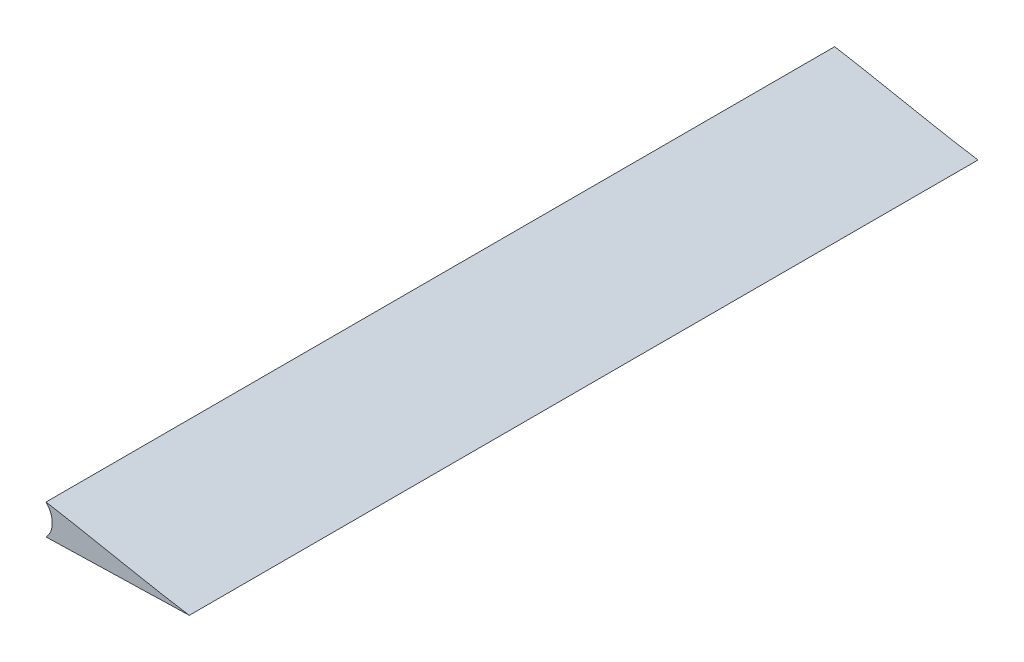
ISO-10303-21;
HEADER;
FILE_DESCRIPTION(('STEP AP214'),'2;1');
FILE_NAME('part.step','',(''),(''),'','','');
FILE_SCHEMA(('AUTOMOTIVE_DESIGN { 1 0 10303 214 1 1 1 1 }'));
ENDSEC;
DATA;
#1=APPLICATION_CONTEXT('core data for automotive mechanical design processes');
#2=APPLICATION_PROTOCOL_DEFINITION('international standard','automotive_design',2000,#1);
#3=PRODUCT_CONTEXT('',#1,'mechanical');
#4=PRODUCT('Part','Part','',(#3));
#5=PRODUCT_RELATED_PRODUCT_CATEGORY('part','',(#4));
#6=PRODUCT_DEFINITION_FORMATION('','',#4);
#7=PRODUCT_DEFINITION_CONTEXT('part definition',#1,'design');
#8=PRODUCT_DEFINITION('design','',#6,#7);
#9=PRODUCT_DEFINITION_SHAPE('','',#8);
#10=(LENGTH_UNIT() NAMED_UNIT(*) SI_UNIT(.MILLI.,.METRE.));
#11=(NAMED_UNIT(*) PLANE_ANGLE_UNIT() SI_UNIT($,.RADIAN.));
#12=(NAMED_UNIT(*) SI_UNIT($,.STERADIAN.) SOLID_ANGLE_UNIT());
#13=UNCERTAINTY_MEASURE_WITH_UNIT(LENGTH_MEASURE(1.E-05),#10,'distance_accuracy_value','');
#14=(GEOMETRIC_REPRESENTATION_CONTEXT(3) GLOBAL_UNCERTAINTY_ASSIGNED_CONTEXT((#13)) GLOBAL_UNIT_ASSIGNED_CONTEXT((#10,
#11,#12)) REPRESENTATION_CONTEXT('',''));
#15=CARTESIAN_POINT('',(0.,0.,0.));
#16=DIRECTION('',(0.,0.,1.));
#17=DIRECTION('',(1.,0.,0.));
#18=AXIS2_PLACEMENT_3D('',#15,#16,#17);
#19=CARTESIAN_POINT('',(100.918242869635,-5.70312155972156,875.));
#20=CARTESIAN_POINT('',(100.917928301793,-5.69198405836472,875.));
#21=CARTESIAN_POINT('',(100.10387255541,-5.62352228888477,875.));
#22=CARTESIAN_POINT('',(99.2805924787461,-5.46457437941949,875.));
#23=CARTESIAN_POINT('',(97.3018387610102,-5.16729318068841,875.));
#24=CARTESIAN_POINT('',(94.8937922035613,-4.74031320806905,875.));
#25=CARTESIAN_POINT('',(91.7634180326536,-4.19402072090437,875.));
#26=CARTESIAN_POINT('',(88.0757791314598,-3.52709242375945,875.));
#27=CARTESIAN_POINT('',(83.8258683203558,-2.7338398887422,875.));
#28=CARTESIAN_POINT('',(79.0746653904455,-1.82915983321444,875.));
#29=CARTESIAN_POINT('',(73.8682926545335,-0.815261424369521,875.));
#30=CARTESIAN_POINT('',(68.2575867578557,0.281496710181075,875.));
#31=CARTESIAN_POINT('',(62.2976992437029,1.44772435993441,875.));
#32=CARTESIAN_POINT('',(56.0406275155923,2.65954132518187,875.));
#33=CARTESIAN_POINT('',(49.5223044176383,3.86329842138598,875.));
#34=CARTESIAN_POINT('',(42.7761633390597,5.02418206260204,875.));
#35=CARTESIAN_POINT('',(35.8424652144832,6.15936269502018,875.));
#36=CARTESIAN_POINT('',(28.7548949857195,7.22523749141442,875.));
#37=CARTESIAN_POINT('',(21.5570881683195,8.21203636309571,875.));
#38=CARTESIAN_POINT('',(14.2899389211875,9.11702244002896,875.));
#39=CARTESIAN_POINT('',(6.98649158126674,9.89650210355032,875.));
#40=CARTESIAN_POINT('',(-0.31229146466516,10.5674397355271,875.));
#41=CARTESIAN_POINT('',(-7.57325093320835,11.1014525657359,875.));
#42=CARTESIAN_POINT('',(-14.7567884271768,11.4844721960287,875.));
#43=CARTESIAN_POINT('',(-21.8292142161482,11.7343249899717,875.));
#44=CARTESIAN_POINT('',(-28.7563545150705,11.8210091917914,875.));
#45=CARTESIAN_POINT('',(-35.5035223333169,11.7506173931394,875.));
#46=CARTESIAN_POINT('',(-42.0399272145928,11.5280996785659,875.));
#47=CARTESIAN_POINT('',(-48.3376180525475,11.1396685856208,875.));
#48=CARTESIAN_POINT('',(-54.368823590549,10.5993161188278,875.));
#49=CARTESIAN_POINT('',(-60.1078137628036,9.91606598300808,875.));
#50=CARTESIAN_POINT('',(-65.5246311998618,9.08284133402565,875.));
#51=CARTESIAN_POINT('',(-70.6007109713803,8.13358039825953,875.));
#52=CARTESIAN_POINT('',(-75.3121243874859,7.06030936022038,875.));
#53=CARTESIAN_POINT('',(-79.6390126776094,5.88240060478776,875.));
#54=CARTESIAN_POINT('',(-83.5657941936788,4.62059294729546,875.));
#55=CARTESIAN_POINT('',(-87.0745733985271,3.28647899388426,875.));
#56=CARTESIAN_POINT('',(-90.1552552216402,1.90843012274513,875.));
#57=CARTESIAN_POINT('',(-92.7947781002031,0.504611279427612,875.));
#58=CARTESIAN_POINT('',(-94.9830779234318,-0.904381490727133,875.));
#59=CARTESIAN_POINT('',(-96.7129189019401,-2.2701975801555,875.));
#60=CARTESIAN_POINT('',(-98.000485424671,-3.58079275915454,875.));
#61=CARTESIAN_POINT('',(-98.7619057356522,-4.7431958355309,875.));
#62=CARTESIAN_POINT('',(-99.2301090632581,-5.85819372427054,875.));
#63=CARTESIAN_POINT('',(-98.6060252918995,-6.87008215824494,875.));
#64=CARTESIAN_POINT('',(-97.444377041171,-7.5453305846849,875.));
#65=CARTESIAN_POINT('',(-95.7467090817251,-8.18861564790779,875.));
#66=CARTESIAN_POINT('',(-93.4448586660228,-8.65302005006277,875.));
#67=CARTESIAN_POINT('',(-90.5328491856375,-8.98180980569674,875.));
#68=CARTESIAN_POINT('',(-87.0127860582048,-9.24993802916623,875.));
#69=CARTESIAN_POINT('',(-82.9066310664121,-9.47123086211927,875.));
#70=CARTESIAN_POINT('',(-78.2402207744729,-9.5911083476405,875.));
#71=CARTESIAN_POINT('',(-73.047587860927,-9.70003593625301,875.));
#72=CARTESIAN_POINT('',(-67.364458993906,-9.72682521205635,875.));
#73=CARTESIAN_POINT('',(-61.2329456663301,-9.73559881849179,875.));
#74=CARTESIAN_POINT('',(-54.695580066044,-9.66397132949298,875.));
#75=CARTESIAN_POINT('',(-47.7878601670729,-9.57405054041112,875.));
#76=CARTESIAN_POINT('',(-40.5476604494291,-9.39990522549842,875.));
#77=CARTESIAN_POINT('',(-33.0149068418517,-9.22416889674421,875.));
#78=CARTESIAN_POINT('',(-25.241541211049,-9.02440552376383,875.));
#79=CARTESIAN_POINT('',(-17.2817921202236,-8.80197066728498,875.));
#80=CARTESIAN_POINT('',(-9.19412489466216,-8.57548457521884,875.));
#81=CARTESIAN_POINT('',(-1.03475350320872,-8.38960097567362,875.));
#82=CARTESIAN_POINT('',(7.13493172426889,-8.16391426134132,875.));
#83=CARTESIAN_POINT('',(15.2619153059295,-7.93721196551508,875.));
#84=CARTESIAN_POINT('',(23.2920199469726,-7.75326587738116,875.));
#85=CARTESIAN_POINT('',(31.1719891282351,-7.52041286471104,875.));
#86=CARTESIAN_POINT('',(38.8533388610302,-7.32032333842978,875.));
#87=CARTESIAN_POINT('',(46.282726983524,-7.15503997672915,875.));
#88=CARTESIAN_POINT('',(53.396722649005,-6.94282534524174,875.));
#89=CARTESIAN_POINT('',(60.1347643764967,-6.76442572644932,875.));
#90=CARTESIAN_POINT('',(66.4617978730972,-6.61076011362349,875.));
#91=CARTESIAN_POINT('',(72.370019545206,-6.44406791450927,875.));
#92=CARTESIAN_POINT('',(77.8516908370389,-6.30469387873606,875.));
#93=CARTESIAN_POINT('',(82.8702925290339,-6.18945193371191,875.));
#94=CARTESIAN_POINT('',(87.3729744895545,-6.07418455055627,875.));
#95=CARTESIAN_POINT('',(91.2866368972505,-5.94365740290611,875.));
#96=CARTESIAN_POINT('',(94.6105801016291,-5.86381881005005,875.));
#97=CARTESIAN_POINT('',(97.1585045394195,-5.8207005319733,875.));
#98=CARTESIAN_POINT('',(99.2314529908179,-5.73825639570641,875.));
#99=CARTESIAN_POINT('',(100.085997803177,-5.73399991417884,875.));
#100=CARTESIAN_POINT('',(100.918560501522,-5.71436754579513,875.));
#101=CARTESIAN_POINT('',(100.918242869635,-5.70312155972156,875.));
#102=B_SPLINE_CURVE_WITH_KNOTS('',3,(#19,#20,#21,#22,#23,#24,#25,#26,#27,#28,#29,#30,#31,#32,
#33,#34,#35,#36,#37,#38,#39,#40,#41,#42,#43,#44,#45,#46,#47,#48,#49,#50,#51,#52,#53,#54,#55,#56,
#57,#58,#59,#60,#61,#62,#63,#64,#65,#66,#67,#68,#69,#70,#71,#72,#73,#74,#75,#76,#77,#78,#79,#80,
#81,#82,#83,#84,#85,#86,#87,#88,#89,#90,#91,#92,#93,#94,#95,#96,#97,#98,#99,#100,#101),
.UNSPECIFIED.,.T.,.F.,(4,1,1,1,1,1,1,1,1,1,1,1,1,1,1,1,1,1,1,1,1,1,1,1,1,1,1,1,1,1,1,1,1,1,1,1,
1,1,1,1,1,1,1,1,1,1,1,1,1,1,1,1,1,1,1,1,1,1,1,1,1,1,1,1,1,1,1,1,1,1,1,1,1,1,1,1,1,1,1,1,4),(0.,
0.000950607256080683,0.00375650719066246,0.00831711830518814,0.0145215342884101,
0.0222932577146515,0.0315598243393391,0.0422207516758567,0.0541509547964426,0.0672310262306302,
0.0813310375166049,0.0963074228768398,0.112011952110719,0.128327294433554,0.145184499499575,
0.162487628976913,0.180135525061467,0.198033487871075,0.21605882858555,0.234134494923981,
0.252191782121554,0.270104077304323,0.287817033152811,0.305234681094631,0.32228444776858,
0.338896328665586,0.3549861088409,0.3705058476665,0.385416955636935,0.399632136124818,
0.413115968198781,0.425822529578469,0.437703697321329,0.448737409392791,0.458879724153294,
0.468105332962517,0.476404611912194,0.483748471478625,0.490133859938562,0.495557185945741,
0.500011534122997,0.503516098018531,0.506001285786605,0.508215361182165,0.511493606790907,
0.515843652138343,0.521547382532886,0.528754591564628,0.537448665030227,0.547575187866189,
0.559073789891025,0.571867409394551,0.585873248090889,0.600979910722737,0.617080267312518,
0.634081341136593,0.651920682144897,0.670483603160468,0.689642386701722,0.709259498553066,
0.729200940708723,0.749303287247489,0.769441295125621,0.789466277541535,0.809254099942275,
0.828669735918119,0.847597547600215,0.865914742719292,0.883466593841964,0.900078508925935,
0.915617835106359,0.930134997771401,0.943663107271565,0.956049855203852,0.967158864622839,
0.97685265729829,0.984995817128692,0.991471780599749,0.99618355316532,0.999040133363778,1.),.UNSPECIFIED.);
#103=DIRECTION('',(0.,0.,-1.));
#104=VECTOR('',#103,1.);
#105=SURFACE_OF_LINEAR_EXTRUSION('',#102,#104);
#106=DIRECTION('',(0.,0.,-1.));
#107=VECTOR('',#106,1.);
#108=CARTESIAN_POINT('',(44.3701269819734,-7.19395111063311,875.));
#109=LINE('',#108,#107);
#110=CARTESIAN_POINT('',(44.3701269819732,-7.19395111063311,-524.707472239184));
#111=VERTEX_POINT('',#110);
#112=CARTESIAN_POINT('',(44.3701269819732,-7.19395111063311,-835.9));
#113=VERTEX_POINT('',#112);
#114=EDGE_CURVE('E53',#111,#113,#109,.T.);
#115=ORIENTED_EDGE('',*,*,#114,.T.);
#116=CARTESIAN_POINT('',(100.918242869635,-5.70312155972156,-835.9));
#117=CARTESIAN_POINT('',(100.917928301793,-5.69198405836472,-835.9));
#118=CARTESIAN_POINT('',(100.10387255541,-5.62352228888477,-835.9));
#119=CARTESIAN_POINT('',(99.2805924787461,-5.46457437941949,-835.9));
#120=CARTESIAN_POINT('',(97.3018387610102,-5.16729318068841,-835.9));
#121=CARTESIAN_POINT('',(94.8937922035613,-4.74031320806905,-835.9));
#122=CARTESIAN_POINT('',(91.7634180326536,-4.19402072090437,-835.9));
#123=CARTESIAN_POINT('',(88.0757791314598,-3.52709242375945,-835.9));
#124=CARTESIAN_POINT('',(83.8258683203558,-2.7338398887422,-835.9));
#125=CARTESIAN_POINT('',(79.0746653904455,-1.82915983321444,-835.9));
#126=CARTESIAN_POINT('',(73.8682926545335,-0.815261424369521,-835.9));
#127=CARTESIAN_POINT('',(68.2575867578557,0.281496710181075,-835.9));
#128=CARTESIAN_POINT('',(62.2976992437029,1.44772435993441,-835.9));
#129=CARTESIAN_POINT('',(56.0406275155923,2.65954132518187,-835.9));
#130=CARTESIAN_POINT('',(49.5223044176383,3.86329842138598,-835.9));
#131=CARTESIAN_POINT('',(42.7761633390597,5.02418206260204,-835.9));
#132=CARTESIAN_POINT('',(35.8424652144832,6.15936269502018,-835.9));
#133=CARTESIAN_POINT('',(28.7548949857195,7.22523749141442,-835.9));
#134=CARTESIAN_POINT('',(21.5570881683195,8.21203636309571,-835.9));
#135=CARTESIAN_POINT('',(14.2899389211875,9.11702244002896,-835.9));
#136=CARTESIAN_POINT('',(6.98649158126674,9.89650210355032,-835.9));
#137=CARTESIAN_POINT('',(-0.31229146466516,10.5674397355271,-835.9));
#138=CARTESIAN_POINT('',(-7.57325093320835,11.1014525657359,-835.9));
#139=CARTESIAN_POINT('',(-14.7567884271768,11.4844721960287,-835.9));
#140=CARTESIAN_POINT('',(-21.8292142161482,11.7343249899717,-835.9));
#141=CARTESIAN_POINT('',(-28.7563545150705,11.8210091917914,-835.9));
#142=CARTESIAN_POINT('',(-35.5035223333169,11.7506173931394,-835.9));
#143=CARTESIAN_POINT('',(-42.0399272145928,11.5280996785659,-835.9));
#144=CARTESIAN_POINT('',(-48.3376180525475,11.1396685856208,-835.9));
#145=CARTESIAN_POINT('',(-54.368823590549,10.5993161188278,-835.9));
#146=CARTESIAN_POINT('',(-60.1078137628036,9.91606598300808,-835.9));
#147=CARTESIAN_POINT('',(-65.5246311998618,9.08284133402565,-835.9));
#148=CARTESIAN_POINT('',(-70.6007109713803,8.13358039825953,-835.9));
#149=CARTESIAN_POINT('',(-75.3121243874859,7.06030936022038,-835.9));
#150=CARTESIAN_POINT('',(-79.6390126776094,5.88240060478776,-835.9));
#151=CARTESIAN_POINT('',(-83.5657941936788,4.62059294729546,-835.9));
#152=CARTESIAN_POINT('',(-87.0745733985271,3.28647899388426,-835.9));
#153=CARTESIAN_POINT('',(-90.1552552216402,1.90843012274513,-835.9));
#154=CARTESIAN_POINT('',(-92.7947781002031,0.504611279427612,-835.9));
#155=CARTESIAN_POINT('',(-94.9830779234318,-0.904381490727133,-835.9));
#156=CARTESIAN_POINT('',(-96.7129189019401,-2.2701975801555,-835.9));
#157=CARTESIAN_POINT('',(-98.000485424671,-3.58079275915454,-835.9));
#158=CARTESIAN_POINT('',(-98.7619057356522,-4.7431958355309,-835.9));
#159=CARTESIAN_POINT('',(-99.2301090632581,-5.85819372427054,-835.9));
#160=CARTESIAN_POINT('',(-98.6060252918995,-6.87008215824494,-835.9));
#161=CARTESIAN_POINT('',(-97.444377041171,-7.5453305846849,-835.9));
#162=CARTESIAN_POINT('',(-95.7467090817251,-8.18861564790779,-835.9));
#163=CARTESIAN_POINT('',(-93.4448586660228,-8.65302005006277,-835.9));
#164=CARTESIAN_POINT('',(-90.5328491856375,-8.98180980569674,-835.9));
#165=CARTESIAN_POINT('',(-87.0127860582048,-9.24993802916623,-835.9));
#166=CARTESIAN_POINT('',(-82.9066310664121,-9.47123086211927,-835.9));
#167=CARTESIAN_POINT('',(-78.2402207744729,-9.5911083476405,-835.9));
#168=CARTESIAN_POINT('',(-73.047587860927,-9.70003593625301,-835.9));
#169=CARTESIAN_POINT('',(-67.364458993906,-9.72682521205635,-835.9));
#170=CARTESIAN_POINT('',(-61.2329456663301,-9.73559881849179,-835.9));
#171=CARTESIAN_POINT('',(-54.695580066044,-9.66397132949298,-835.9));
#172=CARTESIAN_POINT('',(-47.7878601670729,-9.57405054041112,-835.9));
#173=CARTESIAN_POINT('',(-40.5476604494291,-9.39990522549842,-835.9));
#174=CARTESIAN_POINT('',(-33.0149068418517,-9.22416889674421,-835.9));
#175=CARTESIAN_POINT('',(-25.241541211049,-9.02440552376383,-835.9));
#176=CARTESIAN_POINT('',(-17.2817921202236,-8.80197066728498,-835.9));
#177=CARTESIAN_POINT('',(-9.19412489466216,-8.57548457521884,-835.9));
#178=CARTESIAN_POINT('',(-1.03475350320872,-8.38960097567362,-835.9));
#179=CARTESIAN_POINT('',(7.13493172426889,-8.16391426134132,-835.9));
#180=CARTESIAN_POINT('',(15.2619153059295,-7.93721196551508,-835.9));
#181=CARTESIAN_POINT('',(23.2920199469726,-7.75326587738116,-835.9));
#182=CARTESIAN_POINT('',(31.1719891282351,-7.52041286471104,-835.9));
#183=CARTESIAN_POINT('',(38.8533388610302,-7.32032333842978,-835.9));
#184=CARTESIAN_POINT('',(46.282726983524,-7.15503997672915,-835.9));
#185=CARTESIAN_POINT('',(53.396722649005,-6.94282534524174,-835.9));
#186=CARTESIAN_POINT('',(60.1347643764967,-6.76442572644932,-835.9));
#187=CARTESIAN_POINT('',(66.4617978730972,-6.61076011362349,-835.9));
#188=CARTESIAN_POINT('',(72.370019545206,-6.44406791450927,-835.9));
#189=CARTESIAN_POINT('',(77.8516908370389,-6.30469387873606,-835.9));
#190=CARTESIAN_POINT('',(82.8702925290339,-6.18945193371191,-835.9));
#191=CARTESIAN_POINT('',(87.3729744895545,-6.07418455055627,-835.9));
#192=CARTESIAN_POINT('',(91.2866368972505,-5.94365740290611,-835.9));
#193=CARTESIAN_POINT('',(94.6105801016291,-5.86381881005005,-835.9));
#194=CARTESIAN_POINT('',(97.1585045394195,-5.8207005319733,-835.9));
#195=CARTESIAN_POINT('',(99.2314529908179,-5.73825639570641,-835.9));
#196=CARTESIAN_POINT('',(100.085997803177,-5.73399991417884,-835.9));
#197=CARTESIAN_POINT('',(100.918560501522,-5.71436754579513,-835.9));
#198=CARTESIAN_POINT('',(100.918242869635,-5.70312155972156,-835.9));
#199=B_SPLINE_CURVE_WITH_KNOTS('',3,(#116,#117,#118,#119,#120,#121,#122,#123,#124,#125,#126,
#127,#128,#129,#130,#131,#132,#133,#134,#135,#136,#137,#138,#139,#140,#141,#142,#143,#144,#145,
#146,#147,#148,#149,#150,#151,#152,#153,#154,#155,#156,#157,#158,#159,#160,#161,#162,#163,#164,
#165,#166,#167,#168,#169,#170,#171,#172,#173,#174,#175,#176,#177,#178,#179,#180,#181,#182,#183,
#184,#185,#186,#187,#188,#189,#190,#191,#192,#193,#194,#195,#196,#197,#198),.UNSPECIFIED.,.T.,
.F.,(4,1,1,1,1,1,1,1,1,1,1,1,1,1,1,1,1,1,1,1,1,1,1,1,1,1,1,1,1,1,1,1,1,1,1,1,1,1,1,1,1,1,1,1,1,
1,1,1,1,1,1,1,1,1,1,1,1,1,1,1,1,1,1,1,1,1,1,1,1,1,1,1,1,1,1,1,1,1,1,1,4),(0.,
0.000950607256080683,0.00375650719066246,0.00831711830518814,0.0145215342884101,
0.0222932577146515,0.0315598243393391,0.0422207516758567,0.0541509547964426,0.0672310262306302,
0.0813310375166049,0.0963074228768398,0.112011952110719,0.128327294433554,0.145184499499575,
0.162487628976913,0.180135525061467,0.198033487871075,0.21605882858555,0.234134494923981,
0.252191782121554,0.270104077304323,0.287817033152811,0.305234681094631,0.32228444776858,
0.338896328665586,0.3549861088409,0.3705058476665,0.385416955636935,0.399632136124818,
0.413115968198781,0.425822529578469,0.437703697321329,0.448737409392791,0.458879724153294,
0.468105332962517,0.476404611912194,0.483748471478625,0.490133859938562,0.495557185945741,
0.500011534122997,0.503516098018531,0.506001285786605,0.508215361182165,0.511493606790907,
0.515843652138343,0.521547382532886,0.528754591564628,0.537448665030227,0.547575187866189,
0.559073789891025,0.571867409394551,0.585873248090889,0.600979910722737,0.617080267312518,
0.634081341136593,0.651920682144897,0.670483603160468,0.689642386701722,0.709259498553066,
0.729200940708723,0.749303287247489,0.769441295125621,0.789466277541535,0.809254099942275,
0.828669735918119,0.847597547600215,0.865914742719292,0.883466593841964,0.900078508925935,
0.915617835106359,0.930134997771401,0.943663107271565,0.956049855203852,0.967158864622839,
0.97685265729829,0.984995817128692,0.991471780599749,0.99618355316532,0.999040133363778,1.),.UNSPECIFIED.);
#200=CARTESIAN_POINT('',(100.918243230552,-5.70314710956896,-835.9));
#201=VERTEX_POINT('',#200);
#202=EDGE_CURVE('E79',#113,#201,#199,.T.);
#203=ORIENTED_EDGE('',*,*,#202,.T.);
#204=DIRECTION('',(0.,1.,0.));
#205=VECTOR('',#204,1.);
#206=CARTESIAN_POINT('',(100.918243230552,-9.73559881849179,-835.9));
#207=LINE('',#206,#205);
#208=CARTESIAN_POINT('',(100.918243230552,-5.70312155972156,-835.9));
#209=VERTEX_POINT('',#208);
#210=EDGE_CURVE('E81',#201,#209,#207,.T.);
#211=ORIENTED_EDGE('',*,*,#210,.T.);
#212=CARTESIAN_POINT('',(44.3701269819732,4.74542461393327,-835.9));
#213=VERTEX_POINT('',#212);
#214=EDGE_CURVE('E72',#209,#213,#199,.T.);
#215=ORIENTED_EDGE('',*,*,#214,.T.);
#216=DIRECTION('',(0.,0.,-1.));
#217=VECTOR('',#216,1.);
#218=CARTESIAN_POINT('',(44.3701269819733,4.74542461704168,875.));
#219=LINE('',#218,#217);
#220=CARTESIAN_POINT('',(44.3701269819732,4.74542461393327,-524.707472239184));
#221=VERTEX_POINT('',#220);
#222=EDGE_CURVE('E44',#213,#221,#219,.F.);
#223=ORIENTED_EDGE('',*,*,#222,.T.);
#224=CARTESIAN_POINT('',(100.918242869635,-5.70312155972156,-524.707472239184));
#225=CARTESIAN_POINT('',(100.917928301793,-5.69198405836472,-524.707472239184));
#226=CARTESIAN_POINT('',(100.10387255541,-5.62352228888477,-524.707472239184));
#227=CARTESIAN_POINT('',(99.2805924787461,-5.46457437941949,-524.707472239184));
#228=CARTESIAN_POINT('',(97.3018387610102,-5.16729318068841,-524.707472239184));
#229=CARTESIAN_POINT('',(94.8937922035613,-4.74031320806905,-524.707472239184));
#230=CARTESIAN_POINT('',(91.7634180326536,-4.19402072090437,-524.707472239184));
#231=CARTESIAN_POINT('',(88.0757791314598,-3.52709242375945,-524.707472239184));
#232=CARTESIAN_POINT('',(83.8258683203558,-2.7338398887422,-524.707472239184));
#233=CARTESIAN_POINT('',(79.0746653904455,-1.82915983321444,-524.707472239184));
#234=CARTESIAN_POINT('',(73.8682926545335,-0.815261424369521,-524.707472239184));
#235=CARTESIAN_POINT('',(68.2575867578557,0.281496710181075,-524.707472239184));
#236=CARTESIAN_POINT('',(62.2976992437029,1.44772435993441,-524.707472239184));
#237=CARTESIAN_POINT('',(56.0406275155923,2.65954132518187,-524.707472239184));
#238=CARTESIAN_POINT('',(49.5223044176383,3.86329842138598,-524.707472239184));
#239=CARTESIAN_POINT('',(42.7761633390597,5.02418206260204,-524.707472239184));
#240=CARTESIAN_POINT('',(35.8424652144832,6.15936269502018,-524.707472239184));
#241=CARTESIAN_POINT('',(28.7548949857195,7.22523749141442,-524.707472239184));
#242=CARTESIAN_POINT('',(21.5570881683195,8.21203636309571,-524.707472239184));
#243=CARTESIAN_POINT('',(14.2899389211875,9.11702244002896,-524.707472239184));
#244=CARTESIAN_POINT('',(6.98649158126674,9.89650210355032,-524.707472239184));
#245=CARTESIAN_POINT('',(-0.31229146466516,10.5674397355271,-524.707472239184));
#246=CARTESIAN_POINT('',(-7.57325093320835,11.1014525657359,-524.707472239184));
#247=CARTESIAN_POINT('',(-14.7567884271768,11.4844721960287,-524.707472239184));
#248=CARTESIAN_POINT('',(-21.8292142161482,11.7343249899717,-524.707472239184));
#249=CARTESIAN_POINT('',(-28.7563545150705,11.8210091917914,-524.707472239184));
#250=CARTESIAN_POINT('',(-35.5035223333169,11.7506173931394,-524.707472239184));
#251=CARTESIAN_POINT('',(-42.0399272145928,11.5280996785659,-524.707472239184));
#252=CARTESIAN_POINT('',(-48.3376180525475,11.1396685856208,-524.707472239184));
#253=CARTESIAN_POINT('',(-54.368823590549,10.5993161188278,-524.707472239184));
#254=CARTESIAN_POINT('',(-60.1078137628036,9.91606598300808,-524.707472239184));
#255=CARTESIAN_POINT('',(-65.5246311998618,9.08284133402565,-524.707472239184));
#256=CARTESIAN_POINT('',(-70.6007109713803,8.13358039825953,-524.707472239184));
#257=CARTESIAN_POINT('',(-75.3121243874859,7.06030936022038,-524.707472239184));
#258=CARTESIAN_POINT('',(-79.6390126776094,5.88240060478776,-524.707472239184));
#259=CARTESIAN_POINT('',(-83.5657941936788,4.62059294729546,-524.707472239184));
#260=CARTESIAN_POINT('',(-87.0745733985271,3.28647899388426,-524.707472239184));
#261=CARTESIAN_POINT('',(-90.1552552216402,1.90843012274513,-524.707472239184));
#262=CARTESIAN_POINT('',(-92.7947781002031,0.504611279427612,-524.707472239184));
#263=CARTESIAN_POINT('',(-94.9830779234318,-0.904381490727133,-524.707472239184));
#264=CARTESIAN_POINT('',(-96.7129189019401,-2.2701975801555,-524.707472239184));
#265=CARTESIAN_POINT('',(-98.000485424671,-3.58079275915454,-524.707472239184));
#266=CARTESIAN_POINT('',(-98.7619057356522,-4.7431958355309,-524.707472239184));
#267=CARTESIAN_POINT('',(-99.2301090632581,-5.85819372427054,-524.707472239184));
#268=CARTESIAN_POINT('',(-98.6060252918995,-6.87008215824494,-524.707472239184));
#269=CARTESIAN_POINT('',(-97.444377041171,-7.5453305846849,-524.707472239184));
#270=CARTESIAN_POINT('',(-95.7467090817251,-8.18861564790779,-524.707472239184));
#271=CARTESIAN_POINT('',(-93.4448586660228,-8.65302005006277,-524.707472239184));
#272=CARTESIAN_POINT('',(-90.5328491856375,-8.98180980569674,-524.707472239184));
#273=CARTESIAN_POINT('',(-87.0127860582048,-9.24993802916623,-524.707472239184));
#274=CARTESIAN_POINT('',(-82.9066310664121,-9.47123086211927,-524.707472239184));
#275=CARTESIAN_POINT('',(-78.2402207744729,-9.5911083476405,-524.707472239184));
#276=CARTESIAN_POINT('',(-73.047587860927,-9.70003593625301,-524.707472239184));
#277=CARTESIAN_POINT('',(-67.364458993906,-9.72682521205635,-524.707472239184));
#278=CARTESIAN_POINT('',(-61.2329456663301,-9.73559881849179,-524.707472239184));
#279=CARTESIAN_POINT('',(-54.695580066044,-9.66397132949298,-524.707472239184));
#280=CARTESIAN_POINT('',(-47.7878601670729,-9.57405054041112,-524.707472239184));
#281=CARTESIAN_POINT('',(-40.5476604494291,-9.39990522549842,-524.707472239184));
#282=CARTESIAN_POINT('',(-33.0149068418517,-9.22416889674421,-524.707472239184));
#283=CARTESIAN_POINT('',(-25.241541211049,-9.02440552376383,-524.707472239184));
#284=CARTESIAN_POINT('',(-17.2817921202236,-8.80197066728498,-524.707472239184));
#285=CARTESIAN_POINT('',(-9.19412489466216,-8.57548457521884,-524.707472239184));
#286=CARTESIAN_POINT('',(-1.03475350320872,-8.38960097567362,-524.707472239184));
#287=CARTESIAN_POINT('',(7.13493172426889,-8.16391426134132,-524.707472239184));
#288=CARTESIAN_POINT('',(15.2619153059295,-7.93721196551508,-524.707472239184));
#289=CARTESIAN_POINT('',(23.2920199469726,-7.75326587738116,-524.707472239184));
#290=CARTESIAN_POINT('',(31.1719891282351,-7.52041286471104,-524.707472239184));
#291=CARTESIAN_POINT('',(38.8533388610302,-7.32032333842978,-524.707472239184));
#292=CARTESIAN_POINT('',(46.282726983524,-7.15503997672915,-524.707472239184));
#293=CARTESIAN_POINT('',(53.396722649005,-6.94282534524174,-524.707472239184));
#294=CARTESIAN_POINT('',(60.1347643764967,-6.76442572644932,-524.707472239184));
#295=CARTESIAN_POINT('',(66.4617978730972,-6.61076011362349,-524.707472239184));
#296=CARTESIAN_POINT('',(72.370019545206,-6.44406791450927,-524.707472239184));
#297=CARTESIAN_POINT('',(77.8516908370389,-6.30469387873606,-524.707472239184));
#298=CARTESIAN_POINT('',(82.8702925290339,-6.18945193371191,-524.707472239184));
#299=CARTESIAN_POINT('',(87.3729744895545,-6.07418455055627,-524.707472239184));
#300=CARTESIAN_POINT('',(91.2866368972505,-5.94365740290611,-524.707472239184));
#301=CARTESIAN_POINT('',(94.6105801016291,-5.86381881005005,-524.707472239184));
#302=CARTESIAN_POINT('',(97.1585045394195,-5.8207005319733,-524.707472239184));
#303=CARTESIAN_POINT('',(99.2314529908179,-5.73825639570641,-524.707472239184));
#304=CARTESIAN_POINT('',(100.085997803177,-5.73399991417884,-524.707472239184));
#305=CARTESIAN_POINT('',(100.918560501522,-5.71436754579513,-524.707472239184));
#306=CARTESIAN_POINT('',(100.918242869635,-5.70312155972156,-524.707472239184));
#307=B_SPLINE_CURVE_WITH_KNOTS('',3,(#224,#225,#226,#227,#228,#229,#230,#231,#232,#233,#234,
#235,#236,#237,#238,#239,#240,#241,#242,#243,#244,#245,#246,#247,#248,#249,#250,#251,#252,#253,
#254,#255,#256,#257,#258,#259,#260,#261,#262,#263,#264,#265,#266,#267,#268,#269,#270,#271,#272,
#273,#274,#275,#276,#277,#278,#279,#280,#281,#282,#283,#284,#285,#286,#287,#288,#289,#290,#291,
#292,#293,#294,#295,#296,#297,#298,#299,#300,#301,#302,#303,#304,#305,#306),.UNSPECIFIED.,.T.,
.F.,(4,1,1,1,1,1,1,1,1,1,1,1,1,1,1,1,1,1,1,1,1,1,1,1,1,1,1,1,1,1,1,1,1,1,1,1,1,1,1,1,1,1,1,1,1,
1,1,1,1,1,1,1,1,1,1,1,1,1,1,1,1,1,1,1,1,1,1,1,1,1,1,1,1,1,1,1,1,1,1,1,4),(0.,
0.000950607256080683,0.00375650719066246,0.00831711830518814,0.0145215342884101,
0.0222932577146515,0.0315598243393391,0.0422207516758567,0.0541509547964426,0.0672310262306302,
0.0813310375166049,0.0963074228768398,0.112011952110719,0.128327294433554,0.145184499499575,
0.162487628976913,0.180135525061467,0.198033487871075,0.21605882858555,0.234134494923981,
0.252191782121554,0.270104077304323,0.287817033152811,0.305234681094631,0.32228444776858,
0.338896328665586,0.3549861088409,0.3705058476665,0.385416955636935,0.399632136124818,
0.413115968198781,0.425822529578469,0.437703697321329,0.448737409392791,0.458879724153294,
0.468105332962517,0.476404611912194,0.483748471478625,0.490133859938562,0.495557185945741,
0.500011534122997,0.503516098018531,0.506001285786605,0.508215361182165,0.511493606790907,
0.515843652138343,0.521547382532886,0.528754591564628,0.537448665030227,0.547575187866189,
0.559073789891025,0.571867409394551,0.585873248090889,0.600979910722737,0.617080267312518,
0.634081341136593,0.651920682144897,0.670483603160468,0.689642386701722,0.709259498553066,
0.729200940708723,0.749303287247489,0.769441295125621,0.789466277541535,0.809254099942275,
0.828669735918119,0.847597547600215,0.865914742719292,0.883466593841964,0.900078508925935,
0.915617835106359,0.930134997771401,0.943663107271565,0.956049855203852,0.967158864622839,
0.97685265729829,0.984995817128692,0.991471780599749,0.99618355316532,0.999040133363778,1.),.UNSPECIFIED.);
#308=EDGE_CURVE('E11',#221,#111,#307,.F.);
#309=ORIENTED_EDGE('',*,*,#308,.T.);
#310=EDGE_LOOP('',(#115,#203,#211,#215,#223,#309));
#311=FACE_BOUND('',#310,.T.);
#312=ADVANCED_FACE('F33',(#311),#105,.F.);
#313=CARTESIAN_POINT('',(100.918243230552,-9.73559881849179,-835.9));
#314=DIRECTION('',(0.,0.,1.));
#315=DIRECTION('',(1.,0.,0.));
#316=AXIS2_PLACEMENT_3D('',#313,#314,#315);
#317=PLANE('',#316);
#318=ORIENTED_EDGE('',*,*,#202,.F.);
#319=CARTESIAN_POINT('',(38.40043911969,-1.22426324834992,-835.9));
#320=DIRECTION('',(0.,0.,1.));
#321=DIRECTION('',(-1.,0.,0.));
#322=AXIS2_PLACEMENT_3D('',#319,#320,#321);
#323=CIRCLE('',#322,8.44241353797494);
#324=EDGE_CURVE('E66',#113,#213,#323,.T.);
#325=ORIENTED_EDGE('',*,*,#324,.T.);
#326=ORIENTED_EDGE('',*,*,#214,.F.);
#327=ORIENTED_EDGE('',*,*,#210,.F.);
#328=EDGE_LOOP('',(#318,#325,#326,#327));
#329=FACE_BOUND('',#328,.T.);
#330=ADVANCED_FACE('F75',(#329),#317,.F.);
#331=CARTESIAN_POINT('',(100.918243230552,-9.73559881849179,-524.707472239184));
#332=DIRECTION('',(0.,0.,-1.));
#333=DIRECTION('',(-1.,0.,0.));
#334=AXIS2_PLACEMENT_3D('',#331,#332,#333);
#335=PLANE('',#334);
#336=ORIENTED_EDGE('',*,*,#308,.F.);
#337=CARTESIAN_POINT('',(38.40043911969,-1.22426324834992,-524.707472239184));
#338=DIRECTION('',(0.,0.,1.));
#339=DIRECTION('',(-1.,0.,0.));
#340=AXIS2_PLACEMENT_3D('',#337,#338,#339);
#341=CIRCLE('',#340,8.44241353797494);
#342=EDGE_CURVE('E68',#111,#221,#341,.T.);
#343=ORIENTED_EDGE('',*,*,#342,.F.);
#344=EDGE_LOOP('',(#336,#343));
#345=FACE_BOUND('',#344,.T.);
#346=ADVANCED_FACE('F88',(#345),#335,.F.);
#347=CARTESIAN_POINT('',(38.40043911969,-1.22426324834992,-835.9));
#348=DIRECTION('',(0.,0.,1.));
#349=DIRECTION('',(1.,0.,0.));
#350=AXIS2_PLACEMENT_3D('',#347,#348,#349);
#351=CYLINDRICAL_SURFACE('',#350,8.44241353797494);
#352=ORIENTED_EDGE('',*,*,#342,.T.);
#353=ORIENTED_EDGE('',*,*,#222,.F.);
#354=ORIENTED_EDGE('',*,*,#324,.F.);
#355=ORIENTED_EDGE('',*,*,#114,.F.);
#356=EDGE_LOOP('',(#352,#353,#354,#355));
#357=FACE_BOUND('',#356,.T.);
#358=ADVANCED_FACE('F65',(#357),#351,.F.);
#359=CLOSED_SHELL('',(#312,#330,#346,#358));
#360=MANIFOLD_SOLID_BREP('B2',#359);
#361=ADVANCED_BREP_SHAPE_REPRESENTATION('',(#18,#360),#14);
#362=SHAPE_DEFINITION_REPRESENTATION(#9,#361);
ENDSEC;
END-ISO-10303-21;
